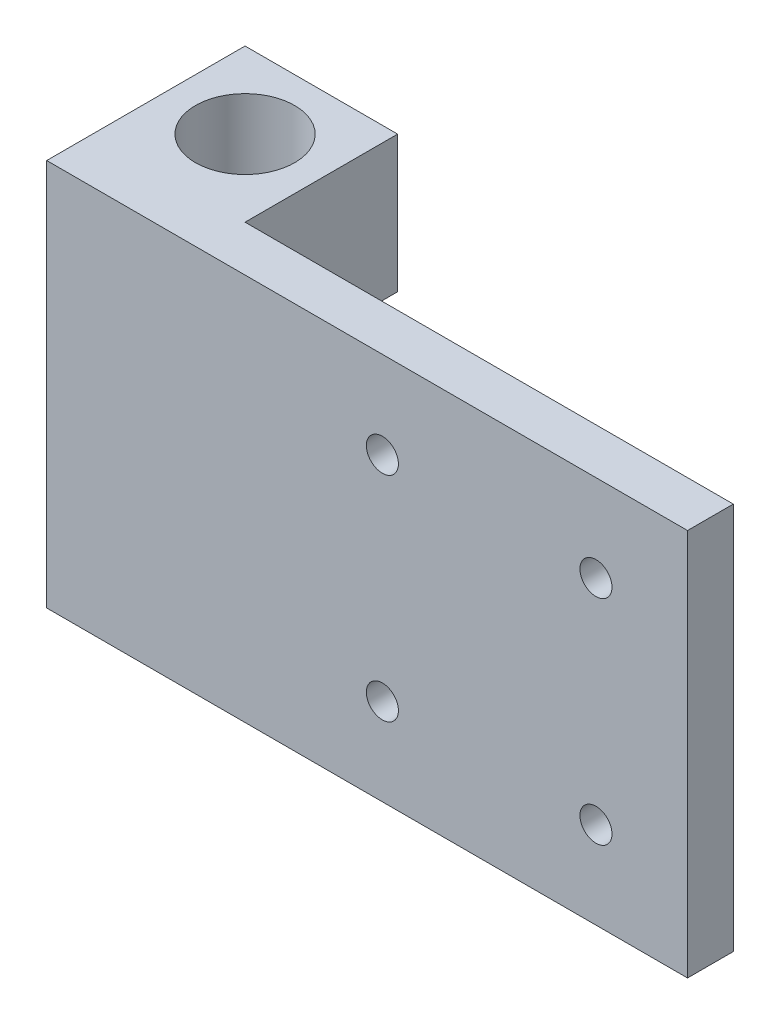
ISO-10303-21;
HEADER;
FILE_DESCRIPTION(('STEP AP214'),'2;1');
FILE_NAME('part.step','',(''),(''),'','','');
FILE_SCHEMA(('AUTOMOTIVE_DESIGN { 1 0 10303 214 1 1 1 1 }'));
ENDSEC;
DATA;
#1=APPLICATION_CONTEXT('core data for automotive mechanical design processes');
#2=APPLICATION_PROTOCOL_DEFINITION('international standard','automotive_design',2000,#1);
#3=PRODUCT_CONTEXT('',#1,'mechanical');
#4=PRODUCT('Part','Part','',(#3));
#5=PRODUCT_RELATED_PRODUCT_CATEGORY('part','',(#4));
#6=PRODUCT_DEFINITION_FORMATION('','',#4);
#7=PRODUCT_DEFINITION_CONTEXT('part definition',#1,'design');
#8=PRODUCT_DEFINITION('design','',#6,#7);
#9=PRODUCT_DEFINITION_SHAPE('','',#8);
#10=(LENGTH_UNIT() NAMED_UNIT(*) SI_UNIT(.MILLI.,.METRE.));
#11=(NAMED_UNIT(*) PLANE_ANGLE_UNIT() SI_UNIT($,.RADIAN.));
#12=(NAMED_UNIT(*) SI_UNIT($,.STERADIAN.) SOLID_ANGLE_UNIT());
#13=UNCERTAINTY_MEASURE_WITH_UNIT(LENGTH_MEASURE(1.E-05),#10,'distance_accuracy_value','');
#14=(GEOMETRIC_REPRESENTATION_CONTEXT(3) GLOBAL_UNCERTAINTY_ASSIGNED_CONTEXT((#13)) GLOBAL_UNIT_ASSIGNED_CONTEXT((#10,
#11,#12)) REPRESENTATION_CONTEXT('',''));
#15=CARTESIAN_POINT('',(0.,0.,0.));
#16=DIRECTION('',(0.,0.,1.));
#17=DIRECTION('',(1.,0.,0.));
#18=AXIS2_PLACEMENT_3D('',#15,#16,#17);
#19=CARTESIAN_POINT('',(0.,0.,6.));
#20=DIRECTION('',(0.,0.,-1.));
#21=DIRECTION('',(-1.,0.,0.));
#22=AXIS2_PLACEMENT_3D('',#19,#20,#21);
#23=PLANE('',#22);
#24=DIRECTION('',(0.,-1.,0.));
#25=VECTOR('',#24,1.);
#26=CARTESIAN_POINT('',(0.,0.,6.));
#27=LINE('',#26,#25);
#28=CARTESIAN_POINT('',(0.,50.8,6.));
#29=VERTEX_POINT('',#28);
#30=CARTESIAN_POINT('',(0.,0.,6.));
#31=VERTEX_POINT('',#30);
#32=EDGE_CURVE('E202',#29,#31,#27,.T.);
#33=ORIENTED_EDGE('',*,*,#32,.T.);
#34=DIRECTION('',(1.,0.,0.));
#35=VECTOR('',#34,1.);
#36=CARTESIAN_POINT('',(0.,0.,6.));
#37=LINE('',#36,#35);
#38=CARTESIAN_POINT('',(84.,0.,6.));
#39=VERTEX_POINT('',#38);
#40=EDGE_CURVE('E205',#31,#39,#37,.T.);
#41=ORIENTED_EDGE('',*,*,#40,.T.);
#42=DIRECTION('',(0.,1.,0.));
#43=VECTOR('',#42,1.);
#44=CARTESIAN_POINT('',(84.,0.,6.));
#45=LINE('',#44,#43);
#46=CARTESIAN_POINT('',(84.,50.8,6.));
#47=VERTEX_POINT('',#46);
#48=EDGE_CURVE('E208',#39,#47,#45,.T.);
#49=ORIENTED_EDGE('',*,*,#48,.T.);
#50=DIRECTION('',(-1.,0.,0.));
#51=VECTOR('',#50,1.);
#52=CARTESIAN_POINT('',(0.,50.8,6.));
#53=LINE('',#52,#51);
#54=EDGE_CURVE('E210',#47,#29,#53,.T.);
#55=ORIENTED_EDGE('',*,*,#54,.T.);
#56=EDGE_LOOP('',(#33,#41,#49,#55));
#57=FACE_BOUND('',#56,.T.);
#58=CARTESIAN_POINT('',(72.,39.4,6.));
#59=DIRECTION('',(0.,0.,1.));
#60=DIRECTION('',(1.,0.,0.));
#61=AXIS2_PLACEMENT_3D('',#58,#59,#60);
#62=CIRCLE('',#61,2.1);
#63=CARTESIAN_POINT('',(74.1,39.4,6.));
#64=VERTEX_POINT('',#63);
#65=EDGE_CURVE('E196',#64,#64,#62,.T.);
#66=ORIENTED_EDGE('',*,*,#65,.F.);
#67=EDGE_LOOP('',(#66));
#68=FACE_BOUND('',#67,.T.);
#69=CARTESIAN_POINT('',(72.,11.4,6.));
#70=DIRECTION('',(0.,0.,1.));
#71=DIRECTION('',(1.,0.,0.));
#72=AXIS2_PLACEMENT_3D('',#69,#70,#71);
#73=CIRCLE('',#72,2.1);
#74=CARTESIAN_POINT('',(74.1,11.4,6.));
#75=VERTEX_POINT('',#74);
#76=EDGE_CURVE('E190',#75,#75,#73,.T.);
#77=ORIENTED_EDGE('',*,*,#76,.F.);
#78=EDGE_LOOP('',(#77));
#79=FACE_BOUND('',#78,.T.);
#80=CARTESIAN_POINT('',(44.,11.4,6.));
#81=DIRECTION('',(0.,0.,1.));
#82=DIRECTION('',(1.,0.,0.));
#83=AXIS2_PLACEMENT_3D('',#80,#81,#82);
#84=CIRCLE('',#83,2.1);
#85=CARTESIAN_POINT('',(46.1,11.4,6.));
#86=VERTEX_POINT('',#85);
#87=EDGE_CURVE('E184',#86,#86,#84,.T.);
#88=ORIENTED_EDGE('',*,*,#87,.F.);
#89=EDGE_LOOP('',(#88));
#90=FACE_BOUND('',#89,.T.);
#91=CARTESIAN_POINT('',(44.,39.4,6.));
#92=DIRECTION('',(0.,0.,1.));
#93=DIRECTION('',(1.,0.,0.));
#94=AXIS2_PLACEMENT_3D('',#91,#92,#93);
#95=CIRCLE('',#94,2.1);
#96=CARTESIAN_POINT('',(46.1,39.4,6.));
#97=VERTEX_POINT('',#96);
#98=EDGE_CURVE('E178',#97,#97,#95,.T.);
#99=ORIENTED_EDGE('',*,*,#98,.F.);
#100=EDGE_LOOP('',(#99));
#101=FACE_BOUND('',#100,.T.);
#102=ADVANCED_FACE('F35',(#57,#68,#79,#90,#101),#23,.F.);
#103=CARTESIAN_POINT('',(0.,0.,0.));
#104=DIRECTION('',(0.,0.,-1.));
#105=DIRECTION('',(-1.,0.,0.));
#106=AXIS2_PLACEMENT_3D('',#103,#104,#105);
#107=PLANE('',#106);
#108=DIRECTION('',(0.,-1.,0.));
#109=VECTOR('',#108,1.);
#110=CARTESIAN_POINT('',(20.,50.8,0.));
#111=LINE('',#110,#109);
#112=CARTESIAN_POINT('',(20.,50.8,0.));
#113=VERTEX_POINT('',#112);
#114=CARTESIAN_POINT('',(20.,0.,0.));
#115=VERTEX_POINT('',#114);
#116=EDGE_CURVE('E58',#113,#115,#111,.T.);
#117=ORIENTED_EDGE('',*,*,#116,.F.);
#118=DIRECTION('',(-1.,0.,0.));
#119=VECTOR('',#118,1.);
#120=CARTESIAN_POINT('',(0.,50.8,0.));
#121=LINE('',#120,#119);
#122=CARTESIAN_POINT('',(84.,50.8,0.));
#123=VERTEX_POINT('',#122);
#124=EDGE_CURVE('E206',#123,#113,#121,.T.);
#125=ORIENTED_EDGE('',*,*,#124,.F.);
#126=DIRECTION('',(0.,1.,0.));
#127=VECTOR('',#126,1.);
#128=CARTESIAN_POINT('',(84.,0.,0.));
#129=LINE('',#128,#127);
#130=CARTESIAN_POINT('',(84.,0.,0.));
#131=VERTEX_POINT('',#130);
#132=EDGE_CURVE('E214',#131,#123,#129,.T.);
#133=ORIENTED_EDGE('',*,*,#132,.F.);
#134=DIRECTION('',(1.,0.,0.));
#135=VECTOR('',#134,1.);
#136=CARTESIAN_POINT('',(0.,0.,0.));
#137=LINE('',#136,#135);
#138=EDGE_CURVE('E199',#115,#131,#137,.T.);
#139=ORIENTED_EDGE('',*,*,#138,.F.);
#140=EDGE_LOOP('',(#117,#125,#133,#139));
#141=FACE_BOUND('',#140,.T.);
#142=CARTESIAN_POINT('',(44.,11.4,0.));
#143=DIRECTION('',(0.,0.,1.));
#144=DIRECTION('',(1.,0.,0.));
#145=AXIS2_PLACEMENT_3D('',#142,#143,#144);
#146=CIRCLE('',#145,2.1);
#147=CARTESIAN_POINT('',(46.1,11.4,0.));
#148=VERTEX_POINT('',#147);
#149=EDGE_CURVE('E181',#148,#148,#146,.T.);
#150=ORIENTED_EDGE('',*,*,#149,.T.);
#151=EDGE_LOOP('',(#150));
#152=FACE_BOUND('',#151,.T.);
#153=CARTESIAN_POINT('',(72.,39.4,0.));
#154=DIRECTION('',(0.,0.,1.));
#155=DIRECTION('',(1.,0.,0.));
#156=AXIS2_PLACEMENT_3D('',#153,#154,#155);
#157=CIRCLE('',#156,2.1);
#158=CARTESIAN_POINT('',(74.1,39.4,0.));
#159=VERTEX_POINT('',#158);
#160=EDGE_CURVE('E193',#159,#159,#157,.T.);
#161=ORIENTED_EDGE('',*,*,#160,.T.);
#162=EDGE_LOOP('',(#161));
#163=FACE_BOUND('',#162,.T.);
#164=CARTESIAN_POINT('',(72.,11.4,0.));
#165=DIRECTION('',(0.,0.,1.));
#166=DIRECTION('',(1.,0.,0.));
#167=AXIS2_PLACEMENT_3D('',#164,#165,#166);
#168=CIRCLE('',#167,2.1);
#169=CARTESIAN_POINT('',(74.1,11.4,0.));
#170=VERTEX_POINT('',#169);
#171=EDGE_CURVE('E187',#170,#170,#168,.T.);
#172=ORIENTED_EDGE('',*,*,#171,.T.);
#173=EDGE_LOOP('',(#172));
#174=FACE_BOUND('',#173,.T.);
#175=CARTESIAN_POINT('',(44.,39.4,0.));
#176=DIRECTION('',(0.,0.,1.));
#177=DIRECTION('',(1.,0.,0.));
#178=AXIS2_PLACEMENT_3D('',#175,#176,#177);
#179=CIRCLE('',#178,2.1);
#180=CARTESIAN_POINT('',(46.1,39.4,0.));
#181=VERTEX_POINT('',#180);
#182=EDGE_CURVE('E177',#181,#181,#179,.T.);
#183=ORIENTED_EDGE('',*,*,#182,.T.);
#184=EDGE_LOOP('',(#183));
#185=FACE_BOUND('',#184,.T.);
#186=ADVANCED_FACE('F228',(#141,#152,#163,#174,#185),#107,.T.);
#187=CARTESIAN_POINT('',(0.,0.,6.));
#188=DIRECTION('',(1.,0.,0.));
#189=DIRECTION('',(0.,0.,-1.));
#190=AXIS2_PLACEMENT_3D('',#187,#188,#189);
#191=PLANE('',#190);
#192=DIRECTION('',(0.,0.,-1.));
#193=VECTOR('',#192,1.);
#194=CARTESIAN_POINT('',(0.,50.8,6.));
#195=LINE('',#194,#193);
#196=CARTESIAN_POINT('',(0.,50.8,-20.));
#197=VERTEX_POINT('',#196);
#198=EDGE_CURVE('E212',#29,#197,#195,.T.);
#199=ORIENTED_EDGE('',*,*,#198,.T.);
#200=DIRECTION('',(0.,1.,0.));
#201=VECTOR('',#200,1.);
#202=CARTESIAN_POINT('',(0.,50.8,-20.));
#203=LINE('',#202,#201);
#204=CARTESIAN_POINT('',(0.,0.,-20.));
#205=VERTEX_POINT('',#204);
#206=EDGE_CURVE('E165',#205,#197,#203,.T.);
#207=ORIENTED_EDGE('',*,*,#206,.F.);
#208=DIRECTION('',(0.,0.,-1.));
#209=VECTOR('',#208,1.);
#210=CARTESIAN_POINT('',(0.,0.,6.));
#211=LINE('',#210,#209);
#212=EDGE_CURVE('E11',#31,#205,#211,.T.);
#213=ORIENTED_EDGE('',*,*,#212,.F.);
#214=ORIENTED_EDGE('',*,*,#32,.F.);
#215=EDGE_LOOP('',(#199,#207,#213,#214));
#216=FACE_BOUND('',#215,.T.);
#217=ADVANCED_FACE('F37',(#216),#191,.F.);
#218=CARTESIAN_POINT('',(0.,0.,6.));
#219=DIRECTION('',(0.,1.,0.));
#220=DIRECTION('',(0.,0.,1.));
#221=AXIS2_PLACEMENT_3D('',#218,#219,#220);
#222=PLANE('',#221);
#223=CARTESIAN_POINT('',(10.,0.,-10.));
#224=DIRECTION('',(0.,-1.,0.));
#225=DIRECTION('',(0.,0.,-1.));
#226=AXIS2_PLACEMENT_3D('',#223,#224,#225);
#227=CIRCLE('',#226,6.5);
#228=CARTESIAN_POINT('',(10.,0.,-16.5));
#229=VERTEX_POINT('',#228);
#230=EDGE_CURVE('E143',#229,#229,#227,.T.);
#231=ORIENTED_EDGE('',*,*,#230,.F.);
#232=EDGE_LOOP('',(#231));
#233=FACE_BOUND('',#232,.T.);
#234=ORIENTED_EDGE('',*,*,#212,.T.);
#235=DIRECTION('',(-1.,0.,0.));
#236=VECTOR('',#235,1.);
#237=CARTESIAN_POINT('',(20.,0.,-20.));
#238=LINE('',#237,#236);
#239=CARTESIAN_POINT('',(20.,0.,-20.));
#240=VERTEX_POINT('',#239);
#241=EDGE_CURVE('E161',#240,#205,#238,.T.);
#242=ORIENTED_EDGE('',*,*,#241,.F.);
#243=DIRECTION('',(0.,0.,1.));
#244=VECTOR('',#243,1.);
#245=CARTESIAN_POINT('',(20.,0.,-20.));
#246=LINE('',#245,#244);
#247=EDGE_CURVE('E174',#240,#115,#246,.T.);
#248=ORIENTED_EDGE('',*,*,#247,.T.);
#249=ORIENTED_EDGE('',*,*,#138,.T.);
#250=DIRECTION('',(0.,0.,-1.));
#251=VECTOR('',#250,1.);
#252=CARTESIAN_POINT('',(84.,0.,6.));
#253=LINE('',#252,#251);
#254=EDGE_CURVE('E43',#39,#131,#253,.T.);
#255=ORIENTED_EDGE('',*,*,#254,.F.);
#256=ORIENTED_EDGE('',*,*,#40,.F.);
#257=EDGE_LOOP('',(#234,#242,#248,#249,#255,#256));
#258=FACE_BOUND('',#257,.T.);
#259=ADVANCED_FACE('F250',(#233,#258),#222,.F.);
#260=CARTESIAN_POINT('',(84.,0.,6.));
#261=DIRECTION('',(-1.,0.,0.));
#262=DIRECTION('',(0.,0.,1.));
#263=AXIS2_PLACEMENT_3D('',#260,#261,#262);
#264=PLANE('',#263);
#265=ORIENTED_EDGE('',*,*,#132,.T.);
#266=DIRECTION('',(0.,0.,-1.));
#267=VECTOR('',#266,1.);
#268=CARTESIAN_POINT('',(84.,50.8,6.));
#269=LINE('',#268,#267);
#270=EDGE_CURVE('E218',#47,#123,#269,.T.);
#271=ORIENTED_EDGE('',*,*,#270,.F.);
#272=ORIENTED_EDGE('',*,*,#48,.F.);
#273=ORIENTED_EDGE('',*,*,#254,.T.);
#274=EDGE_LOOP('',(#265,#271,#272,#273));
#275=FACE_BOUND('',#274,.T.);
#276=ADVANCED_FACE('F225',(#275),#264,.F.);
#277=CARTESIAN_POINT('',(0.,50.8,6.));
#278=DIRECTION('',(0.,-1.,0.));
#279=DIRECTION('',(0.,0.,-1.));
#280=AXIS2_PLACEMENT_3D('',#277,#278,#279);
#281=PLANE('',#280);
#282=CARTESIAN_POINT('',(10.,50.8,-10.));
#283=DIRECTION('',(0.,1.,0.));
#284=DIRECTION('',(0.,0.,1.));
#285=AXIS2_PLACEMENT_3D('',#282,#283,#284);
#286=CIRCLE('',#285,6.5);
#287=CARTESIAN_POINT('',(10.,50.8,-3.5));
#288=VERTEX_POINT('',#287);
#289=EDGE_CURVE('E150',#288,#288,#286,.T.);
#290=ORIENTED_EDGE('',*,*,#289,.F.);
#291=EDGE_LOOP('',(#290));
#292=FACE_BOUND('',#291,.T.);
#293=ORIENTED_EDGE('',*,*,#124,.T.);
#294=DIRECTION('',(0.,0.,1.));
#295=VECTOR('',#294,1.);
#296=CARTESIAN_POINT('',(20.,50.8,-20.));
#297=LINE('',#296,#295);
#298=CARTESIAN_POINT('',(20.,50.8,-20.));
#299=VERTEX_POINT('',#298);
#300=EDGE_CURVE('E170',#299,#113,#297,.T.);
#301=ORIENTED_EDGE('',*,*,#300,.F.);
#302=DIRECTION('',(1.,0.,0.));
#303=VECTOR('',#302,1.);
#304=CARTESIAN_POINT('',(20.,50.8,-20.));
#305=LINE('',#304,#303);
#306=EDGE_CURVE('E168',#197,#299,#305,.T.);
#307=ORIENTED_EDGE('',*,*,#306,.F.);
#308=ORIENTED_EDGE('',*,*,#198,.F.);
#309=ORIENTED_EDGE('',*,*,#54,.F.);
#310=ORIENTED_EDGE('',*,*,#270,.T.);
#311=EDGE_LOOP('',(#293,#301,#307,#308,#309,#310));
#312=FACE_BOUND('',#311,.T.);
#313=ADVANCED_FACE('F232',(#292,#312),#281,.F.);
#314=CARTESIAN_POINT('',(72.,39.4,6.));
#315=DIRECTION('',(0.,0.,-1.));
#316=DIRECTION('',(-1.,0.,0.));
#317=AXIS2_PLACEMENT_3D('',#314,#315,#316);
#318=CYLINDRICAL_SURFACE('',#317,2.1);
#319=ORIENTED_EDGE('',*,*,#65,.T.);
#320=EDGE_LOOP('',(#319));
#321=FACE_BOUND('',#320,.T.);
#322=ORIENTED_EDGE('',*,*,#160,.F.);
#323=EDGE_LOOP('',(#322));
#324=FACE_BOUND('',#323,.T.);
#325=ADVANCED_FACE('F272',(#321,#324),#318,.F.);
#326=CARTESIAN_POINT('',(72.,11.4,6.));
#327=DIRECTION('',(0.,0.,-1.));
#328=DIRECTION('',(-1.,0.,0.));
#329=AXIS2_PLACEMENT_3D('',#326,#327,#328);
#330=CYLINDRICAL_SURFACE('',#329,2.1);
#331=ORIENTED_EDGE('',*,*,#76,.T.);
#332=EDGE_LOOP('',(#331));
#333=FACE_BOUND('',#332,.T.);
#334=ORIENTED_EDGE('',*,*,#171,.F.);
#335=EDGE_LOOP('',(#334));
#336=FACE_BOUND('',#335,.T.);
#337=ADVANCED_FACE('F315',(#333,#336),#330,.F.);
#338=CARTESIAN_POINT('',(44.,11.4,6.));
#339=DIRECTION('',(0.,0.,-1.));
#340=DIRECTION('',(-1.,0.,0.));
#341=AXIS2_PLACEMENT_3D('',#338,#339,#340);
#342=CYLINDRICAL_SURFACE('',#341,2.1);
#343=ORIENTED_EDGE('',*,*,#87,.T.);
#344=EDGE_LOOP('',(#343));
#345=FACE_BOUND('',#344,.T.);
#346=ORIENTED_EDGE('',*,*,#149,.F.);
#347=EDGE_LOOP('',(#346));
#348=FACE_BOUND('',#347,.T.);
#349=ADVANCED_FACE('F312',(#345,#348),#342,.F.);
#350=CARTESIAN_POINT('',(44.,39.4,6.));
#351=DIRECTION('',(0.,0.,-1.));
#352=DIRECTION('',(-1.,0.,0.));
#353=AXIS2_PLACEMENT_3D('',#350,#351,#352);
#354=CYLINDRICAL_SURFACE('',#353,2.1);
#355=ORIENTED_EDGE('',*,*,#98,.T.);
#356=EDGE_LOOP('',(#355));
#357=FACE_BOUND('',#356,.T.);
#358=ORIENTED_EDGE('',*,*,#182,.F.);
#359=EDGE_LOOP('',(#358));
#360=FACE_BOUND('',#359,.T.);
#361=ADVANCED_FACE('F309',(#357,#360),#354,.F.);
#362=CARTESIAN_POINT('',(20.,50.8,-20.));
#363=DIRECTION('',(-1.,0.,0.));
#364=DIRECTION('',(0.,-1.,0.));
#365=AXIS2_PLACEMENT_3D('',#362,#363,#364);
#366=PLANE('',#365);
#367=DIRECTION('',(0.,-1.,0.));
#368=VECTOR('',#367,1.);
#369=CARTESIAN_POINT('',(20.,50.8,-20.));
#370=LINE('',#369,#368);
#371=CARTESIAN_POINT('',(20.,17.9,-20.));
#372=VERTEX_POINT('',#371);
#373=EDGE_CURVE('E162',#372,#240,#370,.T.);
#374=ORIENTED_EDGE('',*,*,#373,.F.);
#375=DIRECTION('',(0.,0.,-1.));
#376=VECTOR('',#375,1.);
#377=CARTESIAN_POINT('',(20.,17.9,-10.));
#378=LINE('',#377,#376);
#379=CARTESIAN_POINT('',(20.,17.9,-10.));
#380=VERTEX_POINT('',#379);
#381=EDGE_CURVE('E144',#380,#372,#378,.T.);
#382=ORIENTED_EDGE('',*,*,#381,.F.);
#383=DIRECTION('',(0.,-1.,0.));
#384=VECTOR('',#383,1.);
#385=CARTESIAN_POINT('',(20.,32.9,-10.));
#386=LINE('',#385,#384);
#387=CARTESIAN_POINT('',(20.,32.9,-10.));
#388=VERTEX_POINT('',#387);
#389=EDGE_CURVE('E127',#388,#380,#386,.T.);
#390=ORIENTED_EDGE('',*,*,#389,.F.);
#391=DIRECTION('',(0.,0.,-1.));
#392=VECTOR('',#391,1.);
#393=CARTESIAN_POINT('',(20.,32.9,-10.));
#394=LINE('',#393,#392);
#395=CARTESIAN_POINT('',(20.,32.9,-20.));
#396=VERTEX_POINT('',#395);
#397=EDGE_CURVE('E118',#388,#396,#394,.T.);
#398=ORIENTED_EDGE('',*,*,#397,.T.);
#399=EDGE_CURVE('E158',#299,#396,#370,.T.);
#400=ORIENTED_EDGE('',*,*,#399,.F.);
#401=ORIENTED_EDGE('',*,*,#300,.T.);
#402=ORIENTED_EDGE('',*,*,#116,.T.);
#403=ORIENTED_EDGE('',*,*,#247,.F.);
#404=EDGE_LOOP('',(#374,#382,#390,#398,#400,#401,#402,#403));
#405=FACE_BOUND('',#404,.T.);
#406=ADVANCED_FACE('F238',(#405),#366,.F.);
#407=CARTESIAN_POINT('',(0.,0.,-20.));
#408=DIRECTION('',(0.,0.,-1.));
#409=DIRECTION('',(-1.,0.,0.));
#410=AXIS2_PLACEMENT_3D('',#407,#408,#409);
#411=PLANE('',#410);
#412=DIRECTION('',(-1.,0.,0.));
#413=VECTOR('',#412,1.);
#414=CARTESIAN_POINT('',(10.,17.9,-20.));
#415=LINE('',#414,#413);
#416=CARTESIAN_POINT('',(10.,17.9,-20.));
#417=VERTEX_POINT('',#416);
#418=EDGE_CURVE('E131',#372,#417,#415,.T.);
#419=ORIENTED_EDGE('',*,*,#418,.F.);
#420=ORIENTED_EDGE('',*,*,#373,.T.);
#421=ORIENTED_EDGE('',*,*,#241,.T.);
#422=ORIENTED_EDGE('',*,*,#206,.T.);
#423=ORIENTED_EDGE('',*,*,#306,.T.);
#424=ORIENTED_EDGE('',*,*,#399,.T.);
#425=DIRECTION('',(1.,0.,0.));
#426=VECTOR('',#425,1.);
#427=CARTESIAN_POINT('',(10.,32.9,-20.));
#428=LINE('',#427,#426);
#429=CARTESIAN_POINT('',(10.,32.9,-20.));
#430=VERTEX_POINT('',#429);
#431=EDGE_CURVE('E134',#430,#396,#428,.T.);
#432=ORIENTED_EDGE('',*,*,#431,.F.);
#433=DIRECTION('',(0.,1.,0.));
#434=VECTOR('',#433,1.);
#435=CARTESIAN_POINT('',(10.,32.9,-20.));
#436=LINE('',#435,#434);
#437=EDGE_CURVE('E50',#417,#430,#436,.T.);
#438=ORIENTED_EDGE('',*,*,#437,.F.);
#439=EDGE_LOOP('',(#419,#420,#421,#422,#423,#424,#432,#438));
#440=FACE_BOUND('',#439,.T.);
#441=ADVANCED_FACE('F242',(#440),#411,.T.);
#442=CARTESIAN_POINT('',(10.,40.8,-10.));
#443=DIRECTION('',(0.,1.,0.));
#444=DIRECTION('',(0.,0.,1.));
#445=AXIS2_PLACEMENT_3D('',#442,#443,#444);
#446=CYLINDRICAL_SURFACE('',#445,6.5);
#447=CARTESIAN_POINT('',(10.,40.8,-10.));
#448=DIRECTION('',(0.,1.,0.));
#449=DIRECTION('',(0.,0.,1.));
#450=AXIS2_PLACEMENT_3D('',#447,#448,#449);
#451=CIRCLE('',#450,6.5);
#452=CARTESIAN_POINT('',(10.,40.8,-3.5));
#453=VERTEX_POINT('',#452);
#454=EDGE_CURVE('E153',#453,#453,#451,.T.);
#455=ORIENTED_EDGE('',*,*,#454,.F.);
#456=EDGE_LOOP('',(#455));
#457=FACE_BOUND('',#456,.T.);
#458=ORIENTED_EDGE('',*,*,#289,.T.);
#459=EDGE_LOOP('',(#458));
#460=FACE_BOUND('',#459,.T.);
#461=ADVANCED_FACE('F297',(#457,#460),#446,.F.);
#462=CARTESIAN_POINT('',(10.,40.8,-10.));
#463=DIRECTION('',(0.,1.,0.));
#464=DIRECTION('',(0.,0.,1.));
#465=AXIS2_PLACEMENT_3D('',#462,#463,#464);
#466=PLANE('',#465);
#467=ORIENTED_EDGE('',*,*,#454,.T.);
#468=EDGE_LOOP('',(#467));
#469=FACE_BOUND('',#468,.T.);
#470=ADVANCED_FACE('F288',(#469),#466,.T.);
#471=CARTESIAN_POINT('',(10.,10.,-10.));
#472=DIRECTION('',(0.,-1.,0.));
#473=DIRECTION('',(0.,0.,-1.));
#474=AXIS2_PLACEMENT_3D('',#471,#472,#473);
#475=CYLINDRICAL_SURFACE('',#474,6.5);
#476=CARTESIAN_POINT('',(10.,10.,-10.));
#477=DIRECTION('',(0.,-1.,0.));
#478=DIRECTION('',(0.,0.,-1.));
#479=AXIS2_PLACEMENT_3D('',#476,#477,#478);
#480=CIRCLE('',#479,6.5);
#481=CARTESIAN_POINT('',(10.,10.,-16.5));
#482=VERTEX_POINT('',#481);
#483=EDGE_CURVE('E147',#482,#482,#480,.T.);
#484=ORIENTED_EDGE('',*,*,#483,.F.);
#485=EDGE_LOOP('',(#484));
#486=FACE_BOUND('',#485,.T.);
#487=ORIENTED_EDGE('',*,*,#230,.T.);
#488=EDGE_LOOP('',(#487));
#489=FACE_BOUND('',#488,.T.);
#490=ADVANCED_FACE('F286',(#486,#489),#475,.F.);
#491=CARTESIAN_POINT('',(10.,10.,-10.));
#492=DIRECTION('',(0.,-1.,0.));
#493=DIRECTION('',(0.,0.,-1.));
#494=AXIS2_PLACEMENT_3D('',#491,#492,#493);
#495=PLANE('',#494);
#496=ORIENTED_EDGE('',*,*,#483,.T.);
#497=EDGE_LOOP('',(#496));
#498=FACE_BOUND('',#497,.T.);
#499=ADVANCED_FACE('F262',(#498),#495,.T.);
#500=CARTESIAN_POINT('',(10.,32.9,-10.));
#501=DIRECTION('',(-1.,0.,0.));
#502=DIRECTION('',(0.,-1.,0.));
#503=AXIS2_PLACEMENT_3D('',#500,#501,#502);
#504=PLANE('',#503);
#505=ORIENTED_EDGE('',*,*,#437,.T.);
#506=DIRECTION('',(0.,0.,-1.));
#507=VECTOR('',#506,1.);
#508=CARTESIAN_POINT('',(10.,32.9,-10.));
#509=LINE('',#508,#507);
#510=CARTESIAN_POINT('',(10.,32.9,-10.));
#511=VERTEX_POINT('',#510);
#512=EDGE_CURVE('E110',#511,#430,#509,.T.);
#513=ORIENTED_EDGE('',*,*,#512,.F.);
#514=DIRECTION('',(0.,1.,0.));
#515=VECTOR('',#514,1.);
#516=CARTESIAN_POINT('',(10.,32.9,-10.));
#517=LINE('',#516,#515);
#518=CARTESIAN_POINT('',(10.,17.9,-10.));
#519=VERTEX_POINT('',#518);
#520=EDGE_CURVE('E114',#519,#511,#517,.T.);
#521=ORIENTED_EDGE('',*,*,#520,.F.);
#522=DIRECTION('',(0.,0.,-1.));
#523=VECTOR('',#522,1.);
#524=CARTESIAN_POINT('',(10.,17.9,-10.));
#525=LINE('',#524,#523);
#526=EDGE_CURVE('E141',#519,#417,#525,.T.);
#527=ORIENTED_EDGE('',*,*,#526,.T.);
#528=EDGE_LOOP('',(#505,#513,#521,#527));
#529=FACE_BOUND('',#528,.T.);
#530=ADVANCED_FACE('F112',(#529),#504,.F.);
#531=CARTESIAN_POINT('',(10.,17.9,-10.));
#532=DIRECTION('',(0.,-1.,0.));
#533=DIRECTION('',(0.,0.,-1.));
#534=AXIS2_PLACEMENT_3D('',#531,#532,#533);
#535=PLANE('',#534);
#536=ORIENTED_EDGE('',*,*,#418,.T.);
#537=ORIENTED_EDGE('',*,*,#526,.F.);
#538=DIRECTION('',(-1.,0.,0.));
#539=VECTOR('',#538,1.);
#540=CARTESIAN_POINT('',(10.,17.9,-10.));
#541=LINE('',#540,#539);
#542=EDGE_CURVE('E119',#380,#519,#541,.T.);
#543=ORIENTED_EDGE('',*,*,#542,.F.);
#544=ORIENTED_EDGE('',*,*,#381,.T.);
#545=EDGE_LOOP('',(#536,#537,#543,#544));
#546=FACE_BOUND('',#545,.T.);
#547=ADVANCED_FACE('F254',(#546),#535,.F.);
#548=CARTESIAN_POINT('',(10.,32.9,-10.));
#549=DIRECTION('',(0.,1.,0.));
#550=DIRECTION('',(0.,0.,1.));
#551=AXIS2_PLACEMENT_3D('',#548,#549,#550);
#552=PLANE('',#551);
#553=ORIENTED_EDGE('',*,*,#431,.T.);
#554=ORIENTED_EDGE('',*,*,#397,.F.);
#555=DIRECTION('',(1.,0.,0.));
#556=VECTOR('',#555,1.);
#557=CARTESIAN_POINT('',(10.,32.9,-10.));
#558=LINE('',#557,#556);
#559=EDGE_CURVE('E122',#511,#388,#558,.T.);
#560=ORIENTED_EDGE('',*,*,#559,.F.);
#561=ORIENTED_EDGE('',*,*,#512,.T.);
#562=EDGE_LOOP('',(#553,#554,#560,#561));
#563=FACE_BOUND('',#562,.T.);
#564=ADVANCED_FACE('F123',(#563),#552,.F.);
#565=CARTESIAN_POINT('',(0.,0.,-10.));
#566=DIRECTION('',(0.,0.,1.));
#567=DIRECTION('',(1.,0.,0.));
#568=AXIS2_PLACEMENT_3D('',#565,#566,#567);
#569=PLANE('',#568);
#570=ORIENTED_EDGE('',*,*,#520,.T.);
#571=ORIENTED_EDGE('',*,*,#559,.T.);
#572=ORIENTED_EDGE('',*,*,#389,.T.);
#573=ORIENTED_EDGE('',*,*,#542,.T.);
#574=EDGE_LOOP('',(#570,#571,#572,#573));
#575=FACE_BOUND('',#574,.T.);
#576=ADVANCED_FACE('F129',(#575),#569,.F.);
#577=CLOSED_SHELL('',(#102,#186,#217,#259,#276,#313,#325,#337,#349,#361,#406,#441,#461,#470,
#490,#499,#530,#547,#564,#576));
#578=MANIFOLD_SOLID_BREP('B2',#577);
#579=ADVANCED_BREP_SHAPE_REPRESENTATION('',(#18,#578),#14);
#580=SHAPE_DEFINITION_REPRESENTATION(#9,#579);
ENDSEC;
END-ISO-10303-21;
